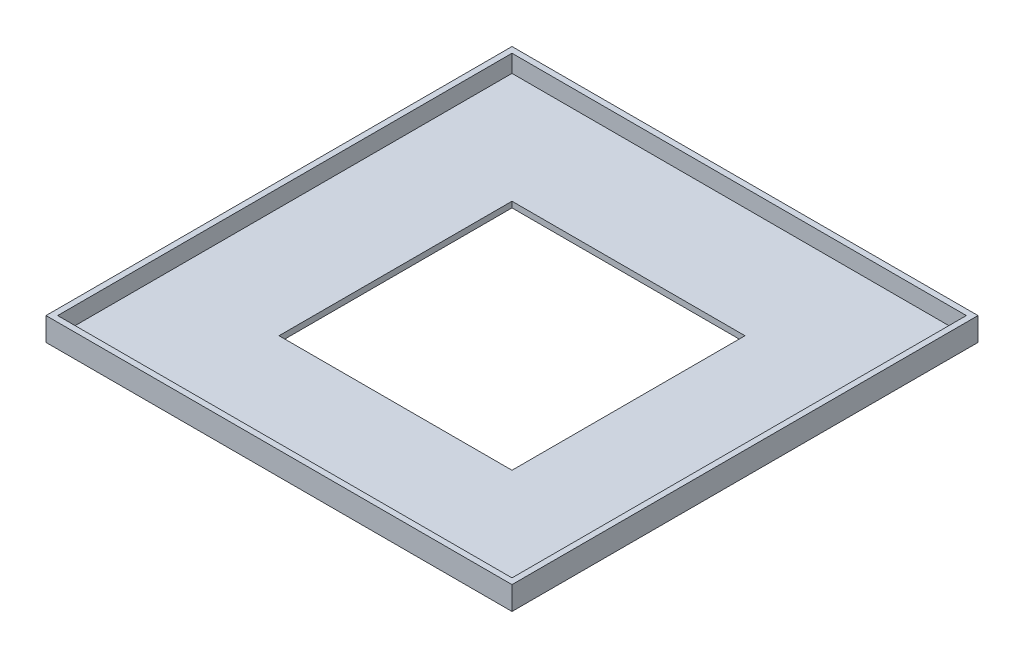
ISO-10303-21;
HEADER;
FILE_DESCRIPTION(('STEP AP214'),'2;1');
FILE_NAME('part.step','',(''),(''),'','','');
FILE_SCHEMA(('AUTOMOTIVE_DESIGN { 1 0 10303 214 1 1 1 1 }'));
ENDSEC;
DATA;
#1=APPLICATION_CONTEXT('core data for automotive mechanical design processes');
#2=APPLICATION_PROTOCOL_DEFINITION('international standard','automotive_design',2000,#1);
#3=PRODUCT_CONTEXT('',#1,'mechanical');
#4=PRODUCT('Part','Part','',(#3));
#5=PRODUCT_RELATED_PRODUCT_CATEGORY('part','',(#4));
#6=PRODUCT_DEFINITION_FORMATION('','',#4);
#7=PRODUCT_DEFINITION_CONTEXT('part definition',#1,'design');
#8=PRODUCT_DEFINITION('design','',#6,#7);
#9=PRODUCT_DEFINITION_SHAPE('','',#8);
#10=(LENGTH_UNIT() NAMED_UNIT(*) SI_UNIT(.MILLI.,.METRE.));
#11=(NAMED_UNIT(*) PLANE_ANGLE_UNIT() SI_UNIT($,.RADIAN.));
#12=(NAMED_UNIT(*) SI_UNIT($,.STERADIAN.) SOLID_ANGLE_UNIT());
#13=UNCERTAINTY_MEASURE_WITH_UNIT(LENGTH_MEASURE(1.E-05),#10,'distance_accuracy_value','');
#14=(GEOMETRIC_REPRESENTATION_CONTEXT(3) GLOBAL_UNCERTAINTY_ASSIGNED_CONTEXT((#13)) GLOBAL_UNIT_ASSIGNED_CONTEXT((#10,
#11,#12)) REPRESENTATION_CONTEXT('',''));
#15=CARTESIAN_POINT('',(0.,0.,0.));
#16=DIRECTION('',(0.,0.,1.));
#17=DIRECTION('',(1.,0.,0.));
#18=AXIS2_PLACEMENT_3D('',#15,#16,#17);
#19=CARTESIAN_POINT('',(-100.,10.,-100.));
#20=DIRECTION('',(1.,0.,0.));
#21=DIRECTION('',(0.,0.,-1.));
#22=AXIS2_PLACEMENT_3D('',#19,#20,#21);
#23=PLANE('',#22);
#24=DIRECTION('',(0.,0.,1.));
#25=VECTOR('',#24,1.);
#26=CARTESIAN_POINT('',(-100.,0.,-100.));
#27=LINE('',#26,#25);
#28=CARTESIAN_POINT('',(-100.,0.,-100.));
#29=VERTEX_POINT('',#28);
#30=CARTESIAN_POINT('',(-100.,0.,100.));
#31=VERTEX_POINT('',#30);
#32=EDGE_CURVE('E185',#29,#31,#27,.T.);
#33=ORIENTED_EDGE('',*,*,#32,.T.);
#34=DIRECTION('',(0.,-1.,0.));
#35=VECTOR('',#34,1.);
#36=CARTESIAN_POINT('',(-100.,10.,100.));
#37=LINE('',#36,#35);
#38=CARTESIAN_POINT('',(-100.,10.,100.));
#39=VERTEX_POINT('',#38);
#40=EDGE_CURVE('E11',#39,#31,#37,.T.);
#41=ORIENTED_EDGE('',*,*,#40,.F.);
#42=DIRECTION('',(0.,0.,1.));
#43=VECTOR('',#42,1.);
#44=CARTESIAN_POINT('',(-100.,10.,-100.));
#45=LINE('',#44,#43);
#46=CARTESIAN_POINT('',(-100.,10.,-100.));
#47=VERTEX_POINT('',#46);
#48=EDGE_CURVE('E219',#47,#39,#45,.T.);
#49=ORIENTED_EDGE('',*,*,#48,.F.);
#50=DIRECTION('',(0.,-1.,0.));
#51=VECTOR('',#50,1.);
#52=CARTESIAN_POINT('',(-100.,10.,-100.));
#53=LINE('',#52,#51);
#54=EDGE_CURVE('E233',#47,#29,#53,.T.);
#55=ORIENTED_EDGE('',*,*,#54,.T.);
#56=EDGE_LOOP('',(#33,#41,#49,#55));
#57=FACE_BOUND('',#56,.T.);
#58=ADVANCED_FACE('F38',(#57),#23,.F.);
#59=CARTESIAN_POINT('',(-100.,10.,100.));
#60=DIRECTION('',(0.,0.,-1.));
#61=DIRECTION('',(-1.,0.,0.));
#62=AXIS2_PLACEMENT_3D('',#59,#60,#61);
#63=PLANE('',#62);
#64=DIRECTION('',(1.,0.,0.));
#65=VECTOR('',#64,1.);
#66=CARTESIAN_POINT('',(-100.,0.,100.));
#67=LINE('',#66,#65);
#68=CARTESIAN_POINT('',(100.,0.,100.));
#69=VERTEX_POINT('',#68);
#70=EDGE_CURVE('E237',#31,#69,#67,.T.);
#71=ORIENTED_EDGE('',*,*,#70,.T.);
#72=DIRECTION('',(0.,-1.,0.));
#73=VECTOR('',#72,1.);
#74=CARTESIAN_POINT('',(100.,10.,100.));
#75=LINE('',#74,#73);
#76=CARTESIAN_POINT('',(100.,10.,100.));
#77=VERTEX_POINT('',#76);
#78=EDGE_CURVE('E46',#77,#69,#75,.T.);
#79=ORIENTED_EDGE('',*,*,#78,.F.);
#80=DIRECTION('',(1.,0.,0.));
#81=VECTOR('',#80,1.);
#82=CARTESIAN_POINT('',(-100.,10.,100.));
#83=LINE('',#82,#81);
#84=EDGE_CURVE('E223',#39,#77,#83,.T.);
#85=ORIENTED_EDGE('',*,*,#84,.F.);
#86=ORIENTED_EDGE('',*,*,#40,.T.);
#87=EDGE_LOOP('',(#71,#79,#85,#86));
#88=FACE_BOUND('',#87,.T.);
#89=ADVANCED_FACE('F271',(#88),#63,.F.);
#90=CARTESIAN_POINT('',(100.,10.,-100.));
#91=DIRECTION('',(-1.,0.,0.));
#92=DIRECTION('',(0.,0.,1.));
#93=AXIS2_PLACEMENT_3D('',#90,#91,#92);
#94=PLANE('',#93);
#95=DIRECTION('',(0.,0.,-1.));
#96=VECTOR('',#95,1.);
#97=CARTESIAN_POINT('',(100.,0.,-100.));
#98=LINE('',#97,#96);
#99=CARTESIAN_POINT('',(100.,0.,-100.));
#100=VERTEX_POINT('',#99);
#101=EDGE_CURVE('E240',#69,#100,#98,.T.);
#102=ORIENTED_EDGE('',*,*,#101,.T.);
#103=DIRECTION('',(0.,-1.,0.));
#104=VECTOR('',#103,1.);
#105=CARTESIAN_POINT('',(100.,10.,-100.));
#106=LINE('',#105,#104);
#107=CARTESIAN_POINT('',(100.,10.,-100.));
#108=VERTEX_POINT('',#107);
#109=EDGE_CURVE('E248',#108,#100,#106,.T.);
#110=ORIENTED_EDGE('',*,*,#109,.F.);
#111=DIRECTION('',(0.,0.,-1.));
#112=VECTOR('',#111,1.);
#113=CARTESIAN_POINT('',(100.,10.,-100.));
#114=LINE('',#113,#112);
#115=EDGE_CURVE('E227',#77,#108,#114,.T.);
#116=ORIENTED_EDGE('',*,*,#115,.F.);
#117=ORIENTED_EDGE('',*,*,#78,.T.);
#118=EDGE_LOOP('',(#102,#110,#116,#117));
#119=FACE_BOUND('',#118,.T.);
#120=ADVANCED_FACE('F257',(#119),#94,.F.);
#121=CARTESIAN_POINT('',(-100.,10.,-100.));
#122=DIRECTION('',(0.,0.,1.));
#123=DIRECTION('',(1.,0.,0.));
#124=AXIS2_PLACEMENT_3D('',#121,#122,#123);
#125=PLANE('',#124);
#126=DIRECTION('',(-1.,0.,0.));
#127=VECTOR('',#126,1.);
#128=CARTESIAN_POINT('',(-100.,0.,-100.));
#129=LINE('',#128,#127);
#130=EDGE_CURVE('E224',#100,#29,#129,.T.);
#131=ORIENTED_EDGE('',*,*,#130,.T.);
#132=ORIENTED_EDGE('',*,*,#54,.F.);
#133=DIRECTION('',(-1.,0.,0.));
#134=VECTOR('',#133,1.);
#135=CARTESIAN_POINT('',(-100.,10.,-100.));
#136=LINE('',#135,#134);
#137=EDGE_CURVE('E230',#108,#47,#136,.T.);
#138=ORIENTED_EDGE('',*,*,#137,.F.);
#139=ORIENTED_EDGE('',*,*,#109,.T.);
#140=EDGE_LOOP('',(#131,#132,#138,#139));
#141=FACE_BOUND('',#140,.T.);
#142=ADVANCED_FACE('F264',(#141),#125,.F.);
#143=CARTESIAN_POINT('',(0.,10.,0.));
#144=DIRECTION('',(0.,1.,0.));
#145=DIRECTION('',(0.,0.,1.));
#146=AXIS2_PLACEMENT_3D('',#143,#144,#145);
#147=PLANE('',#146);
#148=DIRECTION('',(0.,0.,1.));
#149=VECTOR('',#148,1.);
#150=CARTESIAN_POINT('',(-97.5,10.,-100.));
#151=LINE('',#150,#149);
#152=CARTESIAN_POINT('',(-97.5,10.,-97.5));
#153=VERTEX_POINT('',#152);
#154=CARTESIAN_POINT('',(-97.5,10.,97.5));
#155=VERTEX_POINT('',#154);
#156=EDGE_CURVE('E207',#153,#155,#151,.T.);
#157=ORIENTED_EDGE('',*,*,#156,.F.);
#158=DIRECTION('',(-1.,0.,0.));
#159=VECTOR('',#158,1.);
#160=CARTESIAN_POINT('',(-100.,10.,-97.5));
#161=LINE('',#160,#159);
#162=CARTESIAN_POINT('',(97.5,10.,-97.5));
#163=VERTEX_POINT('',#162);
#164=EDGE_CURVE('E192',#163,#153,#161,.T.);
#165=ORIENTED_EDGE('',*,*,#164,.F.);
#166=DIRECTION('',(0.,0.,-1.));
#167=VECTOR('',#166,1.);
#168=CARTESIAN_POINT('',(97.5,10.,-100.));
#169=LINE('',#168,#167);
#170=CARTESIAN_POINT('',(97.5,10.,97.5));
#171=VERTEX_POINT('',#170);
#172=EDGE_CURVE('E213',#171,#163,#169,.T.);
#173=ORIENTED_EDGE('',*,*,#172,.F.);
#174=DIRECTION('',(1.,0.,0.));
#175=VECTOR('',#174,1.);
#176=CARTESIAN_POINT('',(-100.,10.,97.5));
#177=LINE('',#176,#175);
#178=EDGE_CURVE('E210',#155,#171,#177,.T.);
#179=ORIENTED_EDGE('',*,*,#178,.F.);
#180=EDGE_LOOP('',(#157,#165,#173,#179));
#181=FACE_BOUND('',#180,.T.);
#182=ORIENTED_EDGE('',*,*,#48,.T.);
#183=ORIENTED_EDGE('',*,*,#84,.T.);
#184=ORIENTED_EDGE('',*,*,#115,.T.);
#185=ORIENTED_EDGE('',*,*,#137,.T.);
#186=EDGE_LOOP('',(#182,#183,#184,#185));
#187=FACE_BOUND('',#186,.T.);
#188=ADVANCED_FACE('F270',(#181,#187),#147,.T.);
#189=CARTESIAN_POINT('',(0.,0.,0.));
#190=DIRECTION('',(0.,1.,0.));
#191=DIRECTION('',(0.,0.,1.));
#192=AXIS2_PLACEMENT_3D('',#189,#190,#191);
#193=PLANE('',#192);
#194=DIRECTION('',(-1.,0.,0.));
#195=VECTOR('',#194,1.);
#196=CARTESIAN_POINT('',(-50.,0.,-50.));
#197=LINE('',#196,#195);
#198=CARTESIAN_POINT('',(50.,0.,-50.));
#199=VERTEX_POINT('',#198);
#200=CARTESIAN_POINT('',(-50.,0.,-50.));
#201=VERTEX_POINT('',#200);
#202=EDGE_CURVE('E139',#199,#201,#197,.T.);
#203=ORIENTED_EDGE('',*,*,#202,.T.);
#204=DIRECTION('',(0.,0.,1.));
#205=VECTOR('',#204,1.);
#206=CARTESIAN_POINT('',(-50.,0.,-50.));
#207=LINE('',#206,#205);
#208=CARTESIAN_POINT('',(-50.,0.,50.));
#209=VERTEX_POINT('',#208);
#210=EDGE_CURVE('E130',#201,#209,#207,.T.);
#211=ORIENTED_EDGE('',*,*,#210,.T.);
#212=DIRECTION('',(1.,0.,0.));
#213=VECTOR('',#212,1.);
#214=CARTESIAN_POINT('',(-50.,0.,50.));
#215=LINE('',#214,#213);
#216=CARTESIAN_POINT('',(50.,0.,50.));
#217=VERTEX_POINT('',#216);
#218=EDGE_CURVE('E142',#209,#217,#215,.T.);
#219=ORIENTED_EDGE('',*,*,#218,.T.);
#220=DIRECTION('',(0.,0.,-1.));
#221=VECTOR('',#220,1.);
#222=CARTESIAN_POINT('',(50.,0.,-50.));
#223=LINE('',#222,#221);
#224=EDGE_CURVE('E58',#217,#199,#223,.T.);
#225=ORIENTED_EDGE('',*,*,#224,.T.);
#226=EDGE_LOOP('',(#203,#211,#219,#225));
#227=FACE_BOUND('',#226,.T.);
#228=ORIENTED_EDGE('',*,*,#32,.F.);
#229=ORIENTED_EDGE('',*,*,#130,.F.);
#230=ORIENTED_EDGE('',*,*,#101,.F.);
#231=ORIENTED_EDGE('',*,*,#70,.F.);
#232=EDGE_LOOP('',(#228,#229,#230,#231));
#233=FACE_BOUND('',#232,.T.);
#234=ADVANCED_FACE('F147',(#227,#233),#193,.F.);
#235=CARTESIAN_POINT('',(-97.5,10.,-100.));
#236=DIRECTION('',(1.,0.,0.));
#237=DIRECTION('',(0.,0.,-1.));
#238=AXIS2_PLACEMENT_3D('',#235,#236,#237);
#239=PLANE('',#238);
#240=DIRECTION('',(0.,0.,1.));
#241=VECTOR('',#240,1.);
#242=CARTESIAN_POINT('',(-97.5,2.5,-100.));
#243=LINE('',#242,#241);
#244=CARTESIAN_POINT('',(-97.5,2.5,-97.5));
#245=VERTEX_POINT('',#244);
#246=CARTESIAN_POINT('',(-97.5,2.5,97.5));
#247=VERTEX_POINT('',#246);
#248=EDGE_CURVE('E171',#245,#247,#243,.T.);
#249=ORIENTED_EDGE('',*,*,#248,.F.);
#250=DIRECTION('',(0.,-1.,0.));
#251=VECTOR('',#250,1.);
#252=CARTESIAN_POINT('',(-97.5,10.,-97.5));
#253=LINE('',#252,#251);
#254=EDGE_CURVE('E187',#153,#245,#253,.T.);
#255=ORIENTED_EDGE('',*,*,#254,.F.);
#256=ORIENTED_EDGE('',*,*,#156,.T.);
#257=DIRECTION('',(0.,-1.,0.));
#258=VECTOR('',#257,1.);
#259=CARTESIAN_POINT('',(-97.5,10.,97.5));
#260=LINE('',#259,#258);
#261=EDGE_CURVE('E181',#155,#247,#260,.T.);
#262=ORIENTED_EDGE('',*,*,#261,.T.);
#263=EDGE_LOOP('',(#249,#255,#256,#262));
#264=FACE_BOUND('',#263,.T.);
#265=ADVANCED_FACE('F283',(#264),#239,.T.);
#266=CARTESIAN_POINT('',(-100.,10.,97.5));
#267=DIRECTION('',(0.,0.,-1.));
#268=DIRECTION('',(-1.,0.,0.));
#269=AXIS2_PLACEMENT_3D('',#266,#267,#268);
#270=PLANE('',#269);
#271=DIRECTION('',(1.,0.,0.));
#272=VECTOR('',#271,1.);
#273=CARTESIAN_POINT('',(-100.,2.5,97.5));
#274=LINE('',#273,#272);
#275=CARTESIAN_POINT('',(97.5,2.5,97.5));
#276=VERTEX_POINT('',#275);
#277=EDGE_CURVE('E180',#247,#276,#274,.T.);
#278=ORIENTED_EDGE('',*,*,#277,.F.);
#279=ORIENTED_EDGE('',*,*,#261,.F.);
#280=ORIENTED_EDGE('',*,*,#178,.T.);
#281=DIRECTION('',(0.,-1.,0.));
#282=VECTOR('',#281,1.);
#283=CARTESIAN_POINT('',(97.5,10.,97.5));
#284=LINE('',#283,#282);
#285=EDGE_CURVE('E186',#171,#276,#284,.T.);
#286=ORIENTED_EDGE('',*,*,#285,.T.);
#287=EDGE_LOOP('',(#278,#279,#280,#286));
#288=FACE_BOUND('',#287,.T.);
#289=ADVANCED_FACE('F298',(#288),#270,.T.);
#290=CARTESIAN_POINT('',(97.5,10.,-100.));
#291=DIRECTION('',(-1.,0.,0.));
#292=DIRECTION('',(0.,0.,1.));
#293=AXIS2_PLACEMENT_3D('',#290,#291,#292);
#294=PLANE('',#293);
#295=DIRECTION('',(0.,0.,-1.));
#296=VECTOR('',#295,1.);
#297=CARTESIAN_POINT('',(97.5,2.5,-100.));
#298=LINE('',#297,#296);
#299=CARTESIAN_POINT('',(97.5,2.5,-97.5));
#300=VERTEX_POINT('',#299);
#301=EDGE_CURVE('E195',#276,#300,#298,.T.);
#302=ORIENTED_EDGE('',*,*,#301,.F.);
#303=ORIENTED_EDGE('',*,*,#285,.F.);
#304=ORIENTED_EDGE('',*,*,#172,.T.);
#305=DIRECTION('',(0.,-1.,0.));
#306=VECTOR('',#305,1.);
#307=CARTESIAN_POINT('',(97.5,10.,-97.5));
#308=LINE('',#307,#306);
#309=EDGE_CURVE('E191',#163,#300,#308,.T.);
#310=ORIENTED_EDGE('',*,*,#309,.T.);
#311=EDGE_LOOP('',(#302,#303,#304,#310));
#312=FACE_BOUND('',#311,.T.);
#313=ADVANCED_FACE('F294',(#312),#294,.T.);
#314=CARTESIAN_POINT('',(-100.,10.,-97.5));
#315=DIRECTION('',(0.,0.,1.));
#316=DIRECTION('',(1.,0.,0.));
#317=AXIS2_PLACEMENT_3D('',#314,#315,#316);
#318=PLANE('',#317);
#319=DIRECTION('',(-1.,0.,0.));
#320=VECTOR('',#319,1.);
#321=CARTESIAN_POINT('',(-100.,2.5,-97.5));
#322=LINE('',#321,#320);
#323=EDGE_CURVE('E201',#300,#245,#322,.T.);
#324=ORIENTED_EDGE('',*,*,#323,.F.);
#325=ORIENTED_EDGE('',*,*,#309,.F.);
#326=ORIENTED_EDGE('',*,*,#164,.T.);
#327=ORIENTED_EDGE('',*,*,#254,.T.);
#328=EDGE_LOOP('',(#324,#325,#326,#327));
#329=FACE_BOUND('',#328,.T.);
#330=ADVANCED_FACE('F290',(#329),#318,.T.);
#331=CARTESIAN_POINT('',(0.,2.5,0.));
#332=DIRECTION('',(0.,1.,0.));
#333=DIRECTION('',(0.,0.,1.));
#334=AXIS2_PLACEMENT_3D('',#331,#332,#333);
#335=PLANE('',#334);
#336=DIRECTION('',(0.,0.,1.));
#337=VECTOR('',#336,1.);
#338=CARTESIAN_POINT('',(-50.,2.5,-50.));
#339=LINE('',#338,#337);
#340=CARTESIAN_POINT('',(-50.,2.5,-50.));
#341=VERTEX_POINT('',#340);
#342=CARTESIAN_POINT('',(-50.,2.5,50.));
#343=VERTEX_POINT('',#342);
#344=EDGE_CURVE('E133',#341,#343,#339,.T.);
#345=ORIENTED_EDGE('',*,*,#344,.F.);
#346=DIRECTION('',(-1.,0.,0.));
#347=VECTOR('',#346,1.);
#348=CARTESIAN_POINT('',(-50.,2.5,-50.));
#349=LINE('',#348,#347);
#350=CARTESIAN_POINT('',(50.,2.5,-50.));
#351=VERTEX_POINT('',#350);
#352=EDGE_CURVE('E151',#351,#341,#349,.T.);
#353=ORIENTED_EDGE('',*,*,#352,.F.);
#354=DIRECTION('',(0.,0.,-1.));
#355=VECTOR('',#354,1.);
#356=CARTESIAN_POINT('',(50.,2.5,-50.));
#357=LINE('',#356,#355);
#358=CARTESIAN_POINT('',(50.,2.5,50.));
#359=VERTEX_POINT('',#358);
#360=EDGE_CURVE('E53',#359,#351,#357,.T.);
#361=ORIENTED_EDGE('',*,*,#360,.F.);
#362=DIRECTION('',(1.,0.,0.));
#363=VECTOR('',#362,1.);
#364=CARTESIAN_POINT('',(-50.,2.5,50.));
#365=LINE('',#364,#363);
#366=EDGE_CURVE('E163',#343,#359,#365,.T.);
#367=ORIENTED_EDGE('',*,*,#366,.F.);
#368=EDGE_LOOP('',(#345,#353,#361,#367));
#369=FACE_BOUND('',#368,.T.);
#370=ORIENTED_EDGE('',*,*,#248,.T.);
#371=ORIENTED_EDGE('',*,*,#277,.T.);
#372=ORIENTED_EDGE('',*,*,#301,.T.);
#373=ORIENTED_EDGE('',*,*,#323,.T.);
#374=EDGE_LOOP('',(#370,#371,#372,#373));
#375=FACE_BOUND('',#374,.T.);
#376=ADVANCED_FACE('F287',(#369,#375),#335,.T.);
#377=CARTESIAN_POINT('',(-50.,0.,-50.));
#378=DIRECTION('',(-1.,0.,0.));
#379=DIRECTION('',(0.,0.,1.));
#380=AXIS2_PLACEMENT_3D('',#377,#378,#379);
#381=PLANE('',#380);
#382=ORIENTED_EDGE('',*,*,#344,.T.);
#383=DIRECTION('',(0.,1.,0.));
#384=VECTOR('',#383,1.);
#385=CARTESIAN_POINT('',(-50.,0.,50.));
#386=LINE('',#385,#384);
#387=EDGE_CURVE('E126',#209,#343,#386,.T.);
#388=ORIENTED_EDGE('',*,*,#387,.F.);
#389=ORIENTED_EDGE('',*,*,#210,.F.);
#390=DIRECTION('',(0.,1.,0.));
#391=VECTOR('',#390,1.);
#392=CARTESIAN_POINT('',(-50.,0.,-50.));
#393=LINE('',#392,#391);
#394=EDGE_CURVE('E168',#201,#341,#393,.T.);
#395=ORIENTED_EDGE('',*,*,#394,.T.);
#396=EDGE_LOOP('',(#382,#388,#389,#395));
#397=FACE_BOUND('',#396,.T.);
#398=ADVANCED_FACE('F128',(#397),#381,.F.);
#399=CARTESIAN_POINT('',(-50.,0.,-50.));
#400=DIRECTION('',(0.,0.,-1.));
#401=DIRECTION('',(-1.,0.,0.));
#402=AXIS2_PLACEMENT_3D('',#399,#400,#401);
#403=PLANE('',#402);
#404=ORIENTED_EDGE('',*,*,#352,.T.);
#405=ORIENTED_EDGE('',*,*,#394,.F.);
#406=ORIENTED_EDGE('',*,*,#202,.F.);
#407=DIRECTION('',(0.,1.,0.));
#408=VECTOR('',#407,1.);
#409=CARTESIAN_POINT('',(50.,0.,-50.));
#410=LINE('',#409,#408);
#411=EDGE_CURVE('E172',#199,#351,#410,.T.);
#412=ORIENTED_EDGE('',*,*,#411,.T.);
#413=EDGE_LOOP('',(#404,#405,#406,#412));
#414=FACE_BOUND('',#413,.T.);
#415=ADVANCED_FACE('F308',(#414),#403,.F.);
#416=CARTESIAN_POINT('',(50.,0.,-50.));
#417=DIRECTION('',(1.,0.,0.));
#418=DIRECTION('',(0.,0.,-1.));
#419=AXIS2_PLACEMENT_3D('',#416,#417,#418);
#420=PLANE('',#419);
#421=ORIENTED_EDGE('',*,*,#360,.T.);
#422=ORIENTED_EDGE('',*,*,#411,.F.);
#423=ORIENTED_EDGE('',*,*,#224,.F.);
#424=DIRECTION('',(0.,1.,0.));
#425=VECTOR('',#424,1.);
#426=CARTESIAN_POINT('',(50.,0.,50.));
#427=LINE('',#426,#425);
#428=EDGE_CURVE('E138',#217,#359,#427,.T.);
#429=ORIENTED_EDGE('',*,*,#428,.T.);
#430=EDGE_LOOP('',(#421,#422,#423,#429));
#431=FACE_BOUND('',#430,.T.);
#432=ADVANCED_FACE('F311',(#431),#420,.F.);
#433=CARTESIAN_POINT('',(-50.,0.,50.));
#434=DIRECTION('',(0.,0.,1.));
#435=DIRECTION('',(1.,0.,0.));
#436=AXIS2_PLACEMENT_3D('',#433,#434,#435);
#437=PLANE('',#436);
#438=ORIENTED_EDGE('',*,*,#366,.T.);
#439=ORIENTED_EDGE('',*,*,#428,.F.);
#440=ORIENTED_EDGE('',*,*,#218,.F.);
#441=ORIENTED_EDGE('',*,*,#387,.T.);
#442=EDGE_LOOP('',(#438,#439,#440,#441));
#443=FACE_BOUND('',#442,.T.);
#444=ADVANCED_FACE('F143',(#443),#437,.F.);
#445=CLOSED_SHELL('',(#58,#89,#120,#142,#188,#234,#265,#289,#313,#330,#376,#398,#415,#432,#444));
#446=MANIFOLD_SOLID_BREP('B2',#445);
#447=ADVANCED_BREP_SHAPE_REPRESENTATION('',(#18,#446),#14);
#448=SHAPE_DEFINITION_REPRESENTATION(#9,#447);
ENDSEC;
END-ISO-10303-21;
